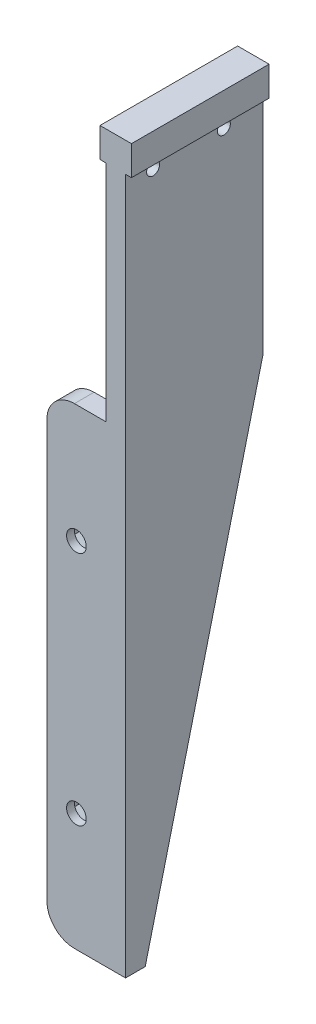
ISO-10303-21;
HEADER;
FILE_DESCRIPTION(('STEP AP214'),'2;1');
FILE_NAME('part.step','',(''),(''),'','','');
FILE_SCHEMA(('AUTOMOTIVE_DESIGN { 1 0 10303 214 1 1 1 1 }'));
ENDSEC;
DATA;
#1=APPLICATION_CONTEXT('core data for automotive mechanical design processes');
#2=APPLICATION_PROTOCOL_DEFINITION('international standard','automotive_design',2000,#1);
#3=PRODUCT_CONTEXT('',#1,'mechanical');
#4=PRODUCT('Part','Part','',(#3));
#5=PRODUCT_RELATED_PRODUCT_CATEGORY('part','',(#4));
#6=PRODUCT_DEFINITION_FORMATION('','',#4);
#7=PRODUCT_DEFINITION_CONTEXT('part definition',#1,'design');
#8=PRODUCT_DEFINITION('design','',#6,#7);
#9=PRODUCT_DEFINITION_SHAPE('','',#8);
#10=(LENGTH_UNIT() NAMED_UNIT(*) SI_UNIT(.MILLI.,.METRE.));
#11=(NAMED_UNIT(*) PLANE_ANGLE_UNIT() SI_UNIT($,.RADIAN.));
#12=(NAMED_UNIT(*) SI_UNIT($,.STERADIAN.) SOLID_ANGLE_UNIT());
#13=UNCERTAINTY_MEASURE_WITH_UNIT(LENGTH_MEASURE(1.E-05),#10,'distance_accuracy_value','');
#14=(GEOMETRIC_REPRESENTATION_CONTEXT(3) GLOBAL_UNCERTAINTY_ASSIGNED_CONTEXT((#13)) GLOBAL_UNIT_ASSIGNED_CONTEXT((#10,
#11,#12)) REPRESENTATION_CONTEXT('',''));
#15=CARTESIAN_POINT('',(0.,0.,0.));
#16=DIRECTION('',(0.,0.,1.));
#17=DIRECTION('',(1.,0.,0.));
#18=AXIS2_PLACEMENT_3D('',#15,#16,#17);
#19=CARTESIAN_POINT('',(43.25,-88.5,0.));
#20=DIRECTION('',(0.,0.,1.));
#21=DIRECTION('',(-1.,0.,0.));
#22=AXIS2_PLACEMENT_3D('',#19,#20,#21);
#23=PLANE('',#22);
#24=DIRECTION('',(-0.866025403784439,-0.5,0.));
#25=VECTOR('',#24,1.);
#26=CARTESIAN_POINT('',(42.,-154.214101615138,0.));
#27=LINE('',#26,#25);
#28=CARTESIAN_POINT('',(44.,-153.059401076758,0.));
#29=VERTEX_POINT('',#28);
#30=CARTESIAN_POINT('',(40.,-155.368802153517,0.));
#31=VERTEX_POINT('',#30);
#32=EDGE_CURVE('E334',#29,#31,#27,.T.);
#33=ORIENTED_EDGE('',*,*,#32,.F.);
#34=DIRECTION('',(0.,-1.,0.));
#35=VECTOR('',#34,1.);
#36=CARTESIAN_POINT('',(44.,-152.576981701919,0.));
#37=LINE('',#36,#35);
#38=CARTESIAN_POINT('',(44.,-148.440598923241,0.));
#39=VERTEX_POINT('',#38);
#40=EDGE_CURVE('E368',#39,#29,#37,.T.);
#41=ORIENTED_EDGE('',*,*,#40,.F.);
#42=DIRECTION('',(0.866025403784439,-0.5,0.));
#43=VECTOR('',#42,1.);
#44=CARTESIAN_POINT('',(43.5822125661116,-148.199389235822,0.));
#45=LINE('',#44,#43);
#46=CARTESIAN_POINT('',(40.,-146.131197846483,0.));
#47=VERTEX_POINT('',#46);
#48=EDGE_CURVE('E364',#47,#39,#45,.T.);
#49=ORIENTED_EDGE('',*,*,#48,.F.);
#50=DIRECTION('',(0.866025403784439,0.5,0.));
#51=VECTOR('',#50,1.);
#52=CARTESIAN_POINT('',(38.,-147.285898384862,0.));
#53=LINE('',#52,#51);
#54=CARTESIAN_POINT('',(36.,-148.440598923241,0.));
#55=VERTEX_POINT('',#54);
#56=EDGE_CURVE('E360',#55,#47,#53,.T.);
#57=ORIENTED_EDGE('',*,*,#56,.F.);
#58=DIRECTION('',(0.,1.,0.));
#59=VECTOR('',#58,1.);
#60=CARTESIAN_POINT('',(36.,-152.576981701919,0.));
#61=LINE('',#60,#59);
#62=CARTESIAN_POINT('',(36.,-153.059401076758,0.));
#63=VERTEX_POINT('',#62);
#64=EDGE_CURVE('E357',#63,#55,#61,.T.);
#65=ORIENTED_EDGE('',*,*,#64,.F.);
#66=DIRECTION('',(-0.866025403784439,0.5,0.));
#67=VECTOR('',#66,1.);
#68=CARTESIAN_POINT('',(39.5822125661117,-155.127592466097,0.));
#69=LINE('',#68,#67);
#70=EDGE_CURVE('E354',#31,#63,#69,.T.);
#71=ORIENTED_EDGE('',*,*,#70,.F.);
#72=EDGE_LOOP('',(#33,#41,#49,#57,#65,#71));
#73=FACE_BOUND('',#72,.T.);
#74=DIRECTION('',(0.,1.,0.));
#75=VECTOR('',#74,1.);
#76=CARTESIAN_POINT('',(32.5,-120.390110716224,0.));
#77=LINE('',#76,#75);
#78=CARTESIAN_POINT('',(32.5,-173.75,0.));
#79=VERTEX_POINT('',#78);
#80=CARTESIAN_POINT('',(32.5,-67.75,0.));
#81=VERTEX_POINT('',#80);
#82=EDGE_CURVE('E465',#79,#81,#77,.T.);
#83=ORIENTED_EDGE('',*,*,#82,.T.);
#84=CARTESIAN_POINT('',(39.5,-67.75,0.));
#85=DIRECTION('',(0.,0.,-1.));
#86=DIRECTION('',(-1.,0.,0.));
#87=AXIS2_PLACEMENT_3D('',#84,#85,#86);
#88=CIRCLE('',#87,7.);
#89=CARTESIAN_POINT('',(39.5,-60.75,0.));
#90=VERTEX_POINT('',#89);
#91=EDGE_CURVE('E509',#90,#81,#88,.F.);
#92=ORIENTED_EDGE('',*,*,#91,.F.);
#93=DIRECTION('',(-1.,0.,0.));
#94=VECTOR('',#93,1.);
#95=CARTESIAN_POINT('',(37.6372709870339,-60.75,0.));
#96=LINE('',#95,#94);
#97=CARTESIAN_POINT('',(47.5,-60.75,0.));
#98=VERTEX_POINT('',#97);
#99=EDGE_CURVE('E430',#98,#90,#96,.T.);
#100=ORIENTED_EDGE('',*,*,#99,.F.);
#101=DIRECTION('',(0.,1.,0.));
#102=VECTOR('',#101,1.);
#103=CARTESIAN_POINT('',(47.5,-120.140110716224,0.));
#104=LINE('',#103,#102);
#105=CARTESIAN_POINT('',(47.5,-180.75,0.));
#106=VERTEX_POINT('',#105);
#107=EDGE_CURVE('E394',#106,#98,#104,.T.);
#108=ORIENTED_EDGE('',*,*,#107,.F.);
#109=DIRECTION('',(-1.,0.,0.));
#110=VECTOR('',#109,1.);
#111=CARTESIAN_POINT('',(49.6868979042284,-180.75,0.));
#112=LINE('',#111,#110);
#113=CARTESIAN_POINT('',(39.5,-180.75,0.));
#114=VERTEX_POINT('',#113);
#115=EDGE_CURVE('E421',#106,#114,#112,.T.);
#116=ORIENTED_EDGE('',*,*,#115,.T.);
#117=CARTESIAN_POINT('',(39.5,-173.75,0.));
#118=DIRECTION('',(0.,0.,-1.));
#119=DIRECTION('',(-1.,0.,0.));
#120=AXIS2_PLACEMENT_3D('',#117,#118,#119);
#121=CIRCLE('',#120,7.);
#122=EDGE_CURVE('E513',#79,#114,#121,.F.);
#123=ORIENTED_EDGE('',*,*,#122,.F.);
#124=EDGE_LOOP('',(#83,#92,#100,#108,#116,#123));
#125=FACE_BOUND('',#124,.T.);
#126=DIRECTION('',(-0.866025403784439,-0.5,0.));
#127=VECTOR('',#126,1.);
#128=CARTESIAN_POINT('',(42.,-94.2141016151378,0.));
#129=LINE('',#128,#127);
#130=CARTESIAN_POINT('',(44.,-93.0594010767585,0.));
#131=VERTEX_POINT('',#130);
#132=CARTESIAN_POINT('',(40.,-95.368802153517,0.));
#133=VERTEX_POINT('',#132);
#134=EDGE_CURVE('E302',#131,#133,#129,.T.);
#135=ORIENTED_EDGE('',*,*,#134,.F.);
#136=DIRECTION('',(0.,-1.,0.));
#137=VECTOR('',#136,1.);
#138=CARTESIAN_POINT('',(44.,-90.75,0.));
#139=LINE('',#138,#137);
#140=CARTESIAN_POINT('',(44.,-88.4405989232415,0.));
#141=VERTEX_POINT('',#140);
#142=EDGE_CURVE('E265',#141,#131,#139,.T.);
#143=ORIENTED_EDGE('',*,*,#142,.F.);
#144=DIRECTION('',(0.866025403784439,-0.5,0.));
#145=VECTOR('',#144,1.);
#146=CARTESIAN_POINT('',(45.9094844589459,-89.5430402896273,0.));
#147=LINE('',#146,#145);
#148=CARTESIAN_POINT('',(40.,-86.131197846483,0.));
#149=VERTEX_POINT('',#148);
#150=EDGE_CURVE('E307',#149,#141,#147,.T.);
#151=ORIENTED_EDGE('',*,*,#150,.F.);
#152=DIRECTION('',(0.866025403784439,0.5,0.));
#153=VECTOR('',#152,1.);
#154=CARTESIAN_POINT('',(34.0905155410541,-89.5430402896273,0.));
#155=LINE('',#154,#153);
#156=CARTESIAN_POINT('',(36.,-88.4405989232415,0.));
#157=VERTEX_POINT('',#156);
#158=EDGE_CURVE('E311',#157,#149,#155,.T.);
#159=ORIENTED_EDGE('',*,*,#158,.F.);
#160=DIRECTION('',(0.,1.,0.));
#161=VECTOR('',#160,1.);
#162=CARTESIAN_POINT('',(36.,-90.75,0.));
#163=LINE('',#162,#161);
#164=CARTESIAN_POINT('',(36.,-93.0594010767585,0.));
#165=VERTEX_POINT('',#164);
#166=EDGE_CURVE('E281',#165,#157,#163,.T.);
#167=ORIENTED_EDGE('',*,*,#166,.F.);
#168=DIRECTION('',(-0.866025403784439,0.5,0.));
#169=VECTOR('',#168,1.);
#170=CARTESIAN_POINT('',(41.9094844589459,-96.4712435199029,0.));
#171=LINE('',#170,#169);
#172=EDGE_CURVE('E276',#133,#165,#171,.T.);
#173=ORIENTED_EDGE('',*,*,#172,.F.);
#174=EDGE_LOOP('',(#135,#143,#151,#159,#167,#173));
#175=FACE_BOUND('',#174,.T.);
#176=ADVANCED_FACE('F16',(#73,#125,#175),#23,.F.);
#177=CARTESIAN_POINT('',(47.5,-142.342267394872,5.));
#178=DIRECTION('',(-1.,0.,0.));
#179=DIRECTION('',(0.,1.,0.));
#180=AXIS2_PLACEMENT_3D('',#177,#178,#179);
#181=PLANE('',#180);
#182=CARTESIAN_POINT('',(47.5,-5.95,-20.));
#183=DIRECTION('',(1.,0.,0.));
#184=DIRECTION('',(0.,1.,0.));
#185=AXIS2_PLACEMENT_3D('',#182,#183,#184);
#186=CIRCLE('',#185,1.65);
#187=CARTESIAN_POINT('',(47.5,-4.3,-20.));
#188=VERTEX_POINT('',#187);
#189=EDGE_CURVE('E20',#188,#188,#186,.T.);
#190=ORIENTED_EDGE('',*,*,#189,.T.);
#191=EDGE_LOOP('',(#190));
#192=FACE_BOUND('',#191,.T.);
#193=CARTESIAN_POINT('',(47.5,-5.95,-2.));
#194=DIRECTION('',(1.,0.,0.));
#195=DIRECTION('',(0.,1.,0.));
#196=AXIS2_PLACEMENT_3D('',#193,#194,#195);
#197=CIRCLE('',#196,1.65);
#198=CARTESIAN_POINT('',(47.5,-4.3,-2.));
#199=VERTEX_POINT('',#198);
#200=EDGE_CURVE('E538',#199,#199,#197,.T.);
#201=ORIENTED_EDGE('',*,*,#200,.T.);
#202=EDGE_LOOP('',(#201));
#203=FACE_BOUND('',#202,.T.);
#204=ORIENTED_EDGE('',*,*,#107,.T.);
#205=DIRECTION('',(0.,0.,-1.));
#206=VECTOR('',#205,1.);
#207=CARTESIAN_POINT('',(47.5,-60.75,5.));
#208=LINE('',#207,#206);
#209=CARTESIAN_POINT('',(47.5,-60.75,5.));
#210=VERTEX_POINT('',#209);
#211=EDGE_CURVE('E461',#210,#98,#208,.T.);
#212=ORIENTED_EDGE('',*,*,#211,.F.);
#213=DIRECTION('',(0.,-1.,0.));
#214=VECTOR('',#213,1.);
#215=CARTESIAN_POINT('',(47.5,-142.342267394872,5.));
#216=LINE('',#215,#214);
#217=CARTESIAN_POINT('',(47.5,-3.75,5.));
#218=VERTEX_POINT('',#217);
#219=EDGE_CURVE('E434',#218,#210,#216,.T.);
#220=ORIENTED_EDGE('',*,*,#219,.F.);
#221=DIRECTION('',(0.,0.,-1.));
#222=VECTOR('',#221,1.);
#223=CARTESIAN_POINT('',(47.5,-3.75,5.));
#224=LINE('',#223,#222);
#225=CARTESIAN_POINT('',(47.5,-3.75,-30.));
#226=VERTEX_POINT('',#225);
#227=EDGE_CURVE('E481',#218,#226,#224,.T.);
#228=ORIENTED_EDGE('',*,*,#227,.T.);
#229=DIRECTION('',(0.,1.,0.));
#230=VECTOR('',#229,1.);
#231=CARTESIAN_POINT('',(47.5,-120.140110716224,-30.));
#232=LINE('',#231,#230);
#233=CARTESIAN_POINT('',(47.5,-60.75,-30.));
#234=VERTEX_POINT('',#233);
#235=EDGE_CURVE('E402',#234,#226,#232,.T.);
#236=ORIENTED_EDGE('',*,*,#235,.F.);
#237=DIRECTION('',(0.,-0.970142500145332,0.242535625036333));
#238=VECTOR('',#237,1.);
#239=CARTESIAN_POINT('',(47.5,-145.778016371644,-8.74299590708886));
#240=LINE('',#239,#238);
#241=EDGE_CURVE('E533',#106,#234,#240,.F.);
#242=ORIENTED_EDGE('',*,*,#241,.F.);
#243=EDGE_LOOP('',(#204,#212,#220,#228,#236,#242));
#244=FACE_BOUND('',#243,.T.);
#245=ADVANCED_FACE('F575',(#192,#203,#244),#181,.T.);
#246=CARTESIAN_POINT('',(49.75,-3.75,5.));
#247=DIRECTION('',(0.,1.,0.));
#248=DIRECTION('',(0.,0.,1.));
#249=AXIS2_PLACEMENT_3D('',#246,#247,#248);
#250=PLANE('',#249);
#251=ORIENTED_EDGE('',*,*,#227,.F.);
#252=DIRECTION('',(-1.,0.,0.));
#253=VECTOR('',#252,1.);
#254=CARTESIAN_POINT('',(49.75,-3.75,5.));
#255=LINE('',#254,#253);
#256=CARTESIAN_POINT('',(46.,-3.75,5.));
#257=VERTEX_POINT('',#256);
#258=EDGE_CURVE('E457',#218,#257,#255,.T.);
#259=ORIENTED_EDGE('',*,*,#258,.T.);
#260=DIRECTION('',(0.,0.,-1.));
#261=VECTOR('',#260,1.);
#262=CARTESIAN_POINT('',(46.,-3.75,5.));
#263=LINE('',#262,#261);
#264=CARTESIAN_POINT('',(46.,-3.75,-30.));
#265=VERTEX_POINT('',#264);
#266=EDGE_CURVE('E476',#257,#265,#263,.T.);
#267=ORIENTED_EDGE('',*,*,#266,.T.);
#268=DIRECTION('',(-1.,0.,0.));
#269=VECTOR('',#268,1.);
#270=CARTESIAN_POINT('',(49.75,-3.75,-30.));
#271=LINE('',#270,#269);
#272=EDGE_CURVE('E417',#226,#265,#271,.T.);
#273=ORIENTED_EDGE('',*,*,#272,.F.);
#274=EDGE_LOOP('',(#251,#259,#267,#273));
#275=FACE_BOUND('',#274,.T.);
#276=ADVANCED_FACE('F581',(#275),#250,.F.);
#277=CARTESIAN_POINT('',(46.,8.72091965636974,5.));
#278=DIRECTION('',(-1.,0.,0.));
#279=DIRECTION('',(0.,1.,0.));
#280=AXIS2_PLACEMENT_3D('',#277,#278,#279);
#281=PLANE('',#280);
#282=ORIENTED_EDGE('',*,*,#266,.F.);
#283=DIRECTION('',(0.,-1.,0.));
#284=VECTOR('',#283,1.);
#285=CARTESIAN_POINT('',(46.,8.72091965636974,5.));
#286=LINE('',#285,#284);
#287=CARTESIAN_POINT('',(46.,3.75,5.));
#288=VERTEX_POINT('',#287);
#289=EDGE_CURVE('E458',#288,#257,#286,.T.);
#290=ORIENTED_EDGE('',*,*,#289,.F.);
#291=DIRECTION('',(0.,0.,-1.));
#292=VECTOR('',#291,1.);
#293=CARTESIAN_POINT('',(46.,3.75,5.));
#294=LINE('',#293,#292);
#295=CARTESIAN_POINT('',(46.,3.75,-30.));
#296=VERTEX_POINT('',#295);
#297=EDGE_CURVE('E472',#288,#296,#294,.T.);
#298=ORIENTED_EDGE('',*,*,#297,.T.);
#299=DIRECTION('',(0.,-1.,0.));
#300=VECTOR('',#299,1.);
#301=CARTESIAN_POINT('',(46.,8.72091965636974,-30.));
#302=LINE('',#301,#300);
#303=EDGE_CURVE('E418',#296,#265,#302,.T.);
#304=ORIENTED_EDGE('',*,*,#303,.T.);
#305=EDGE_LOOP('',(#282,#290,#298,#304));
#306=FACE_BOUND('',#305,.T.);
#307=ADVANCED_FACE('F590',(#306),#281,.T.);
#308=CARTESIAN_POINT('',(34.587839727214,3.75,5.));
#309=DIRECTION('',(0.,1.,0.));
#310=DIRECTION('',(0.,0.,1.));
#311=AXIS2_PLACEMENT_3D('',#308,#309,#310);
#312=PLANE('',#311);
#313=ORIENTED_EDGE('',*,*,#297,.F.);
#314=DIRECTION('',(-1.,0.,0.));
#315=VECTOR('',#314,1.);
#316=CARTESIAN_POINT('',(34.587839727214,3.75,5.));
#317=LINE('',#316,#315);
#318=CARTESIAN_POINT('',(54.,3.75,5.));
#319=VERTEX_POINT('',#318);
#320=EDGE_CURVE('E446',#319,#288,#317,.T.);
#321=ORIENTED_EDGE('',*,*,#320,.F.);
#322=DIRECTION('',(0.,0.,-1.));
#323=VECTOR('',#322,1.);
#324=CARTESIAN_POINT('',(54.,3.75,5.));
#325=LINE('',#324,#323);
#326=CARTESIAN_POINT('',(54.,3.75,-30.));
#327=VERTEX_POINT('',#326);
#328=EDGE_CURVE('E477',#319,#327,#325,.T.);
#329=ORIENTED_EDGE('',*,*,#328,.T.);
#330=DIRECTION('',(-1.,0.,0.));
#331=VECTOR('',#330,1.);
#332=CARTESIAN_POINT('',(34.587839727214,3.75,-30.));
#333=LINE('',#332,#331);
#334=EDGE_CURVE('E406',#327,#296,#333,.T.);
#335=ORIENTED_EDGE('',*,*,#334,.T.);
#336=EDGE_LOOP('',(#313,#321,#329,#335));
#337=FACE_BOUND('',#336,.T.);
#338=ADVANCED_FACE('F593',(#337),#312,.T.);
#339=CARTESIAN_POINT('',(54.,8.72091965636975,5.));
#340=DIRECTION('',(-1.,0.,0.));
#341=DIRECTION('',(0.,1.,0.));
#342=AXIS2_PLACEMENT_3D('',#339,#340,#341);
#343=PLANE('',#342);
#344=ORIENTED_EDGE('',*,*,#328,.F.);
#345=DIRECTION('',(0.,-1.,0.));
#346=VECTOR('',#345,1.);
#347=CARTESIAN_POINT('',(54.,8.72091965636975,5.));
#348=LINE('',#347,#346);
#349=CARTESIAN_POINT('',(54.,-3.75,5.));
#350=VERTEX_POINT('',#349);
#351=EDGE_CURVE('E449',#319,#350,#348,.T.);
#352=ORIENTED_EDGE('',*,*,#351,.T.);
#353=DIRECTION('',(0.,0.,-1.));
#354=VECTOR('',#353,1.);
#355=CARTESIAN_POINT('',(54.,-3.75,5.));
#356=LINE('',#355,#354);
#357=CARTESIAN_POINT('',(54.,-3.75,-30.));
#358=VERTEX_POINT('',#357);
#359=EDGE_CURVE('E482',#350,#358,#356,.T.);
#360=ORIENTED_EDGE('',*,*,#359,.T.);
#361=DIRECTION('',(0.,-1.,0.));
#362=VECTOR('',#361,1.);
#363=CARTESIAN_POINT('',(54.,8.72091965636975,-30.));
#364=LINE('',#363,#362);
#365=EDGE_CURVE('E409',#327,#358,#364,.T.);
#366=ORIENTED_EDGE('',*,*,#365,.F.);
#367=EDGE_LOOP('',(#344,#352,#360,#366));
#368=FACE_BOUND('',#367,.T.);
#369=ADVANCED_FACE('F599',(#368),#343,.F.);
#370=ORIENTED_EDGE('',*,*,#359,.F.);
#371=CARTESIAN_POINT('',(52.5,-3.75,5.));
#372=VERTEX_POINT('',#371);
#373=EDGE_CURVE('E453',#350,#372,#255,.T.);
#374=ORIENTED_EDGE('',*,*,#373,.T.);
#375=DIRECTION('',(0.,0.,-1.));
#376=VECTOR('',#375,1.);
#377=CARTESIAN_POINT('',(52.5,-3.75,5.));
#378=LINE('',#377,#376);
#379=CARTESIAN_POINT('',(52.5,-3.75,-30.));
#380=VERTEX_POINT('',#379);
#381=EDGE_CURVE('E486',#372,#380,#378,.T.);
#382=ORIENTED_EDGE('',*,*,#381,.T.);
#383=EDGE_CURVE('E413',#358,#380,#271,.T.);
#384=ORIENTED_EDGE('',*,*,#383,.F.);
#385=EDGE_LOOP('',(#370,#374,#382,#384));
#386=FACE_BOUND('',#385,.T.);
#387=ADVANCED_FACE('F598',(#386),#250,.F.);
#388=CARTESIAN_POINT('',(52.5,-142.342267394872,5.));
#389=DIRECTION('',(-1.,0.,0.));
#390=DIRECTION('',(0.,1.,0.));
#391=AXIS2_PLACEMENT_3D('',#388,#389,#390);
#392=PLANE('',#391);
#393=CARTESIAN_POINT('',(52.5,-5.95,-20.));
#394=DIRECTION('',(-1.,0.,0.));
#395=DIRECTION('',(0.,-1.,0.));
#396=AXIS2_PLACEMENT_3D('',#393,#394,#395);
#397=CIRCLE('',#396,1.65);
#398=CARTESIAN_POINT('',(52.5,-7.6,-20.));
#399=VERTEX_POINT('',#398);
#400=EDGE_CURVE('E541',#399,#399,#397,.T.);
#401=ORIENTED_EDGE('',*,*,#400,.T.);
#402=EDGE_LOOP('',(#401));
#403=FACE_BOUND('',#402,.T.);
#404=CARTESIAN_POINT('',(52.5,-5.95,-2.));
#405=DIRECTION('',(-1.,0.,0.));
#406=DIRECTION('',(0.,-1.,0.));
#407=AXIS2_PLACEMENT_3D('',#404,#405,#406);
#408=CIRCLE('',#407,1.65);
#409=CARTESIAN_POINT('',(52.5,-7.6,-2.));
#410=VERTEX_POINT('',#409);
#411=EDGE_CURVE('E284',#410,#410,#408,.T.);
#412=ORIENTED_EDGE('',*,*,#411,.T.);
#413=EDGE_LOOP('',(#412));
#414=FACE_BOUND('',#413,.T.);
#415=DIRECTION('',(0.,-1.,0.));
#416=VECTOR('',#415,1.);
#417=CARTESIAN_POINT('',(52.5,-142.342267394872,-30.));
#418=LINE('',#417,#416);
#419=CARTESIAN_POINT('',(52.5,-60.75,-30.));
#420=VERTEX_POINT('',#419);
#421=EDGE_CURVE('E398',#380,#420,#418,.T.);
#422=ORIENTED_EDGE('',*,*,#421,.F.);
#423=ORIENTED_EDGE('',*,*,#381,.F.);
#424=DIRECTION('',(0.,-1.,0.));
#425=VECTOR('',#424,1.);
#426=CARTESIAN_POINT('',(52.5,-142.342267394872,5.));
#427=LINE('',#426,#425);
#428=CARTESIAN_POINT('',(52.5,-180.75,5.));
#429=VERTEX_POINT('',#428);
#430=EDGE_CURVE('E425',#372,#429,#427,.T.);
#431=ORIENTED_EDGE('',*,*,#430,.T.);
#432=DIRECTION('',(0.,0.,-1.));
#433=VECTOR('',#432,1.);
#434=CARTESIAN_POINT('',(52.5,-180.75,5.));
#435=LINE('',#434,#433);
#436=CARTESIAN_POINT('',(52.5,-180.75,0.));
#437=VERTEX_POINT('',#436);
#438=EDGE_CURVE('E496',#429,#437,#435,.T.);
#439=ORIENTED_EDGE('',*,*,#438,.T.);
#440=DIRECTION('',(0.,0.970142500145332,-0.242535625036333));
#441=VECTOR('',#440,1.);
#442=CARTESIAN_POINT('',(52.5,-180.75,0.));
#443=LINE('',#442,#441);
#444=EDGE_CURVE('E10',#420,#437,#443,.F.);
#445=ORIENTED_EDGE('',*,*,#444,.F.);
#446=EDGE_LOOP('',(#422,#423,#431,#439,#445));
#447=FACE_BOUND('',#446,.T.);
#448=ADVANCED_FACE('F557',(#403,#414,#447),#392,.F.);
#449=CARTESIAN_POINT('',(49.6868979042284,-180.75,5.));
#450=DIRECTION('',(0.,1.,0.));
#451=DIRECTION('',(0.,0.,1.));
#452=AXIS2_PLACEMENT_3D('',#449,#450,#451);
#453=PLANE('',#452);
#454=ORIENTED_EDGE('',*,*,#438,.F.);
#455=DIRECTION('',(-1.,0.,0.));
#456=VECTOR('',#455,1.);
#457=CARTESIAN_POINT('',(49.6868979042284,-180.75,5.));
#458=LINE('',#457,#456);
#459=CARTESIAN_POINT('',(39.5,-180.75,5.));
#460=VERTEX_POINT('',#459);
#461=EDGE_CURVE('E429',#429,#460,#458,.T.);
#462=ORIENTED_EDGE('',*,*,#461,.T.);
#463=DIRECTION('',(0.,0.,-1.));
#464=VECTOR('',#463,1.);
#465=CARTESIAN_POINT('',(39.5,-180.75,5.));
#466=LINE('',#465,#464);
#467=EDGE_CURVE('E517',#114,#460,#466,.F.);
#468=ORIENTED_EDGE('',*,*,#467,.F.);
#469=ORIENTED_EDGE('',*,*,#115,.F.);
#470=DIRECTION('',(-1.,0.,0.));
#471=VECTOR('',#470,1.);
#472=CARTESIAN_POINT('',(49.6868979042284,-180.75,0.));
#473=LINE('',#472,#471);
#474=EDGE_CURVE('E530',#437,#106,#473,.T.);
#475=ORIENTED_EDGE('',*,*,#474,.F.);
#476=EDGE_LOOP('',(#454,#462,#468,#469,#475));
#477=FACE_BOUND('',#476,.T.);
#478=ADVANCED_FACE('F612',(#477),#453,.F.);
#479=CARTESIAN_POINT('',(32.5,-120.390110716224,5.));
#480=DIRECTION('',(1.,0.,0.));
#481=DIRECTION('',(0.,-1.,0.));
#482=AXIS2_PLACEMENT_3D('',#479,#480,#481);
#483=PLANE('',#482);
#484=DIRECTION('',(0.,1.,0.));
#485=VECTOR('',#484,1.);
#486=CARTESIAN_POINT('',(32.5,-120.390110716224,5.));
#487=LINE('',#486,#485);
#488=CARTESIAN_POINT('',(32.5,-173.75,5.));
#489=VERTEX_POINT('',#488);
#490=CARTESIAN_POINT('',(32.5,-67.75,5.));
#491=VERTEX_POINT('',#490);
#492=EDGE_CURVE('E438',#489,#491,#487,.T.);
#493=ORIENTED_EDGE('',*,*,#492,.T.);
#494=DIRECTION('',(0.,0.,-1.));
#495=VECTOR('',#494,1.);
#496=CARTESIAN_POINT('',(32.5,-67.75,5.));
#497=LINE('',#496,#495);
#498=EDGE_CURVE('E493',#81,#491,#497,.F.);
#499=ORIENTED_EDGE('',*,*,#498,.F.);
#500=ORIENTED_EDGE('',*,*,#82,.F.);
#501=DIRECTION('',(0.,0.,-1.));
#502=VECTOR('',#501,1.);
#503=CARTESIAN_POINT('',(32.5,-173.75,5.));
#504=LINE('',#503,#502);
#505=EDGE_CURVE('E506',#489,#79,#504,.T.);
#506=ORIENTED_EDGE('',*,*,#505,.F.);
#507=EDGE_LOOP('',(#493,#499,#500,#506));
#508=FACE_BOUND('',#507,.T.);
#509=ADVANCED_FACE('F609',(#508),#483,.F.);
#510=CARTESIAN_POINT('',(37.6372709870339,-60.75,5.));
#511=DIRECTION('',(0.,1.,0.));
#512=DIRECTION('',(0.,0.,1.));
#513=AXIS2_PLACEMENT_3D('',#510,#511,#512);
#514=PLANE('',#513);
#515=DIRECTION('',(-1.,0.,0.));
#516=VECTOR('',#515,1.);
#517=CARTESIAN_POINT('',(37.6372709870339,-60.75,5.));
#518=LINE('',#517,#516);
#519=CARTESIAN_POINT('',(39.5,-60.75,5.));
#520=VERTEX_POINT('',#519);
#521=EDGE_CURVE('E442',#210,#520,#518,.T.);
#522=ORIENTED_EDGE('',*,*,#521,.F.);
#523=ORIENTED_EDGE('',*,*,#211,.T.);
#524=ORIENTED_EDGE('',*,*,#99,.T.);
#525=DIRECTION('',(0.,0.,-1.));
#526=VECTOR('',#525,1.);
#527=CARTESIAN_POINT('',(39.5,-60.75,0.));
#528=LINE('',#527,#526);
#529=EDGE_CURVE('E527',#520,#90,#528,.T.);
#530=ORIENTED_EDGE('',*,*,#529,.F.);
#531=EDGE_LOOP('',(#522,#523,#524,#530));
#532=FACE_BOUND('',#531,.T.);
#533=ADVANCED_FACE('F606',(#532),#514,.T.);
#534=CARTESIAN_POINT('',(43.25,-88.5,5.));
#535=DIRECTION('',(0.,0.,1.));
#536=DIRECTION('',(-1.,0.,0.));
#537=AXIS2_PLACEMENT_3D('',#534,#535,#536);
#538=PLANE('',#537);
#539=CARTESIAN_POINT('',(40.,-90.75,4.99999999999545));
#540=DIRECTION('',(0.,0.,-1.));
#541=DIRECTION('',(-1.,0.,0.));
#542=AXIS2_PLACEMENT_3D('',#539,#540,#541);
#543=CIRCLE('',#542,2.5);
#544=CARTESIAN_POINT('',(37.5,-90.75,4.99999999999545));
#545=VERTEX_POINT('',#544);
#546=EDGE_CURVE('E390',#545,#545,#543,.F.);
#547=ORIENTED_EDGE('',*,*,#546,.F.);
#548=EDGE_LOOP('',(#547));
#549=FACE_BOUND('',#548,.T.);
#550=CARTESIAN_POINT('',(40.,-150.75,4.99999999999545));
#551=DIRECTION('',(0.,0.,-1.));
#552=DIRECTION('',(-1.,0.,0.));
#553=AXIS2_PLACEMENT_3D('',#550,#551,#552);
#554=CIRCLE('',#553,2.5);
#555=CARTESIAN_POINT('',(37.5,-150.75,4.99999999999545));
#556=VERTEX_POINT('',#555);
#557=EDGE_CURVE('E270',#556,#556,#554,.F.);
#558=ORIENTED_EDGE('',*,*,#557,.F.);
#559=EDGE_LOOP('',(#558));
#560=FACE_BOUND('',#559,.T.);
#561=ORIENTED_EDGE('',*,*,#461,.F.);
#562=ORIENTED_EDGE('',*,*,#430,.F.);
#563=ORIENTED_EDGE('',*,*,#373,.F.);
#564=ORIENTED_EDGE('',*,*,#351,.F.);
#565=ORIENTED_EDGE('',*,*,#320,.T.);
#566=ORIENTED_EDGE('',*,*,#289,.T.);
#567=ORIENTED_EDGE('',*,*,#258,.F.);
#568=ORIENTED_EDGE('',*,*,#219,.T.);
#569=ORIENTED_EDGE('',*,*,#521,.T.);
#570=CARTESIAN_POINT('',(39.5,-67.75,5.));
#571=DIRECTION('',(0.,0.,-1.));
#572=DIRECTION('',(-1.,0.,0.));
#573=AXIS2_PLACEMENT_3D('',#570,#571,#572);
#574=CIRCLE('',#573,7.);
#575=EDGE_CURVE('E521',#491,#520,#574,.T.);
#576=ORIENTED_EDGE('',*,*,#575,.F.);
#577=ORIENTED_EDGE('',*,*,#492,.F.);
#578=CARTESIAN_POINT('',(39.5,-173.75,5.));
#579=DIRECTION('',(0.,0.,-1.));
#580=DIRECTION('',(-1.,0.,0.));
#581=AXIS2_PLACEMENT_3D('',#578,#579,#580);
#582=CIRCLE('',#581,7.);
#583=EDGE_CURVE('E524',#460,#489,#582,.T.);
#584=ORIENTED_EDGE('',*,*,#583,.F.);
#585=EDGE_LOOP('',(#561,#562,#563,#564,#565,#566,#567,#568,#569,#576,#577,#584));
#586=FACE_BOUND('',#585,.T.);
#587=ADVANCED_FACE('F588',(#549,#560,#586),#538,.T.);
#588=CARTESIAN_POINT('',(43.25,-88.5,-30.));
#589=DIRECTION('',(0.,0.,1.));
#590=DIRECTION('',(-1.,0.,0.));
#591=AXIS2_PLACEMENT_3D('',#588,#589,#590);
#592=PLANE('',#591);
#593=ORIENTED_EDGE('',*,*,#235,.T.);
#594=ORIENTED_EDGE('',*,*,#272,.T.);
#595=ORIENTED_EDGE('',*,*,#303,.F.);
#596=ORIENTED_EDGE('',*,*,#334,.F.);
#597=ORIENTED_EDGE('',*,*,#365,.T.);
#598=ORIENTED_EDGE('',*,*,#383,.T.);
#599=ORIENTED_EDGE('',*,*,#421,.T.);
#600=DIRECTION('',(1.,0.,0.));
#601=VECTOR('',#600,1.);
#602=CARTESIAN_POINT('',(43.25,-60.75,-30.));
#603=LINE('',#602,#601);
#604=EDGE_CURVE('E26',#234,#420,#603,.T.);
#605=ORIENTED_EDGE('',*,*,#604,.F.);
#606=EDGE_LOOP('',(#593,#594,#595,#596,#597,#598,#599,#605));
#607=FACE_BOUND('',#606,.T.);
#608=ADVANCED_FACE('F623',(#607),#592,.F.);
#609=CARTESIAN_POINT('',(39.5,-173.75,5.));
#610=DIRECTION('',(0.,0.,-1.));
#611=DIRECTION('',(1.,0.,0.));
#612=AXIS2_PLACEMENT_3D('',#609,#610,#611);
#613=CYLINDRICAL_SURFACE('',#612,7.);
#614=ORIENTED_EDGE('',*,*,#583,.T.);
#615=ORIENTED_EDGE('',*,*,#505,.T.);
#616=ORIENTED_EDGE('',*,*,#122,.T.);
#617=ORIENTED_EDGE('',*,*,#467,.T.);
#618=EDGE_LOOP('',(#614,#615,#616,#617));
#619=FACE_BOUND('',#618,.T.);
#620=ADVANCED_FACE('F620',(#619),#613,.T.);
#621=CARTESIAN_POINT('',(39.5,-67.75,5.));
#622=DIRECTION('',(0.,0.,1.));
#623=DIRECTION('',(-1.,0.,0.));
#624=AXIS2_PLACEMENT_3D('',#621,#622,#623);
#625=CYLINDRICAL_SURFACE('',#624,7.);
#626=ORIENTED_EDGE('',*,*,#575,.T.);
#627=ORIENTED_EDGE('',*,*,#529,.T.);
#628=ORIENTED_EDGE('',*,*,#91,.T.);
#629=ORIENTED_EDGE('',*,*,#498,.T.);
#630=EDGE_LOOP('',(#626,#627,#628,#629));
#631=FACE_BOUND('',#630,.T.);
#632=ADVANCED_FACE('F622',(#631),#625,.T.);
#633=CARTESIAN_POINT('',(49.6868979042284,-180.75,0.));
#634=DIRECTION('',(0.,0.242535625036333,0.970142500145332));
#635=DIRECTION('',(-1.,0.,0.));
#636=AXIS2_PLACEMENT_3D('',#633,#634,#635);
#637=PLANE('',#636);
#638=ORIENTED_EDGE('',*,*,#444,.T.);
#639=ORIENTED_EDGE('',*,*,#474,.T.);
#640=ORIENTED_EDGE('',*,*,#241,.T.);
#641=ORIENTED_EDGE('',*,*,#604,.T.);
#642=EDGE_LOOP('',(#638,#639,#640,#641));
#643=FACE_BOUND('',#642,.T.);
#644=ADVANCED_FACE('F18',(#643),#637,.F.);
#645=CARTESIAN_POINT('',(40.,-150.75,500000.));
#646=DIRECTION('',(0.,0.,-1.));
#647=DIRECTION('',(1.,0.,0.));
#648=AXIS2_PLACEMENT_3D('',#645,#646,#647);
#649=CYLINDRICAL_SURFACE('',#648,2.5);
#650=CARTESIAN_POINT('',(40.,-150.75,3.));
#651=DIRECTION('',(0.,0.,1.));
#652=DIRECTION('',(-1.,0.,0.));
#653=AXIS2_PLACEMENT_3D('',#650,#651,#652);
#654=CIRCLE('',#653,2.5);
#655=CARTESIAN_POINT('',(37.5,-150.75,3.));
#656=VERTEX_POINT('',#655);
#657=EDGE_CURVE('E329',#656,#656,#654,.T.);
#658=ORIENTED_EDGE('',*,*,#657,.F.);
#659=EDGE_LOOP('',(#658));
#660=FACE_BOUND('',#659,.T.);
#661=ORIENTED_EDGE('',*,*,#557,.T.);
#662=EDGE_LOOP('',(#661));
#663=FACE_BOUND('',#662,.T.);
#664=ADVANCED_FACE('F630',(#660,#663),#649,.F.);
#665=CARTESIAN_POINT('',(40.,-90.75,500000.));
#666=DIRECTION('',(0.,0.,-1.));
#667=DIRECTION('',(1.,0.,0.));
#668=AXIS2_PLACEMENT_3D('',#665,#666,#667);
#669=CYLINDRICAL_SURFACE('',#668,2.5);
#670=CARTESIAN_POINT('',(40.,-90.75,3.));
#671=DIRECTION('',(0.,0.,1.));
#672=DIRECTION('',(-1.,0.,0.));
#673=AXIS2_PLACEMENT_3D('',#670,#671,#672);
#674=CIRCLE('',#673,2.5);
#675=CARTESIAN_POINT('',(37.5,-90.75,3.));
#676=VERTEX_POINT('',#675);
#677=EDGE_CURVE('E298',#676,#676,#674,.T.);
#678=ORIENTED_EDGE('',*,*,#677,.F.);
#679=EDGE_LOOP('',(#678));
#680=FACE_BOUND('',#679,.T.);
#681=ORIENTED_EDGE('',*,*,#546,.T.);
#682=EDGE_LOOP('',(#681));
#683=FACE_BOUND('',#682,.T.);
#684=ADVANCED_FACE('F742',(#680,#683),#669,.F.);
#685=CARTESIAN_POINT('',(42.,-154.214101615138,3.));
#686=DIRECTION('',(-0.5,0.866025403784439,0.));
#687=DIRECTION('',(0.866025403784439,0.5,0.));
#688=AXIS2_PLACEMENT_3D('',#685,#686,#687);
#689=PLANE('',#688);
#690=ORIENTED_EDGE('',*,*,#32,.T.);
#691=DIRECTION('',(0.,0.,-1.));
#692=VECTOR('',#691,1.);
#693=CARTESIAN_POINT('',(40.,-155.368802153517,3.));
#694=LINE('',#693,#692);
#695=CARTESIAN_POINT('',(40.,-155.368802153517,3.));
#696=VERTEX_POINT('',#695);
#697=EDGE_CURVE('E353',#696,#31,#694,.T.);
#698=ORIENTED_EDGE('',*,*,#697,.F.);
#699=DIRECTION('',(-0.866025403784439,-0.5,0.));
#700=VECTOR('',#699,1.);
#701=CARTESIAN_POINT('',(42.,-154.214101615138,3.));
#702=LINE('',#701,#700);
#703=CARTESIAN_POINT('',(44.,-153.059401076758,3.));
#704=VERTEX_POINT('',#703);
#705=EDGE_CURVE('E349',#704,#696,#702,.T.);
#706=ORIENTED_EDGE('',*,*,#705,.F.);
#707=DIRECTION('',(0.,0.,-1.));
#708=VECTOR('',#707,1.);
#709=CARTESIAN_POINT('',(44.,-153.059401076758,3.));
#710=LINE('',#709,#708);
#711=EDGE_CURVE('E304',#704,#29,#710,.T.);
#712=ORIENTED_EDGE('',*,*,#711,.T.);
#713=EDGE_LOOP('',(#690,#698,#706,#712));
#714=FACE_BOUND('',#713,.T.);
#715=ADVANCED_FACE('F746',(#714),#689,.T.);
#716=CARTESIAN_POINT('',(44.,-152.576981701919,3.));
#717=DIRECTION('',(-1.,0.,0.));
#718=DIRECTION('',(0.,1.,0.));
#719=AXIS2_PLACEMENT_3D('',#716,#717,#718);
#720=PLANE('',#719);
#721=ORIENTED_EDGE('',*,*,#40,.T.);
#722=ORIENTED_EDGE('',*,*,#711,.F.);
#723=DIRECTION('',(0.,-1.,0.));
#724=VECTOR('',#723,1.);
#725=CARTESIAN_POINT('',(44.,-152.576981701919,3.));
#726=LINE('',#725,#724);
#727=CARTESIAN_POINT('',(44.,-148.440598923241,3.));
#728=VERTEX_POINT('',#727);
#729=EDGE_CURVE('E346',#728,#704,#726,.T.);
#730=ORIENTED_EDGE('',*,*,#729,.F.);
#731=DIRECTION('',(0.,0.,-1.));
#732=VECTOR('',#731,1.);
#733=CARTESIAN_POINT('',(44.,-148.440598923241,3.));
#734=LINE('',#733,#732);
#735=EDGE_CURVE('E377',#728,#39,#734,.T.);
#736=ORIENTED_EDGE('',*,*,#735,.T.);
#737=EDGE_LOOP('',(#721,#722,#730,#736));
#738=FACE_BOUND('',#737,.T.);
#739=ADVANCED_FACE('F763',(#738),#720,.T.);
#740=CARTESIAN_POINT('',(43.5822125661116,-148.199389235822,3.));
#741=DIRECTION('',(-0.5,-0.866025403784439,0.));
#742=DIRECTION('',(-0.866025403784439,0.5,0.));
#743=AXIS2_PLACEMENT_3D('',#740,#741,#742);
#744=PLANE('',#743);
#745=ORIENTED_EDGE('',*,*,#48,.T.);
#746=ORIENTED_EDGE('',*,*,#735,.F.);
#747=DIRECTION('',(0.866025403784439,-0.5,0.));
#748=VECTOR('',#747,1.);
#749=CARTESIAN_POINT('',(43.5822125661116,-148.199389235822,3.));
#750=LINE('',#749,#748);
#751=CARTESIAN_POINT('',(40.,-146.131197846483,3.));
#752=VERTEX_POINT('',#751);
#753=EDGE_CURVE('E343',#752,#728,#750,.T.);
#754=ORIENTED_EDGE('',*,*,#753,.F.);
#755=DIRECTION('',(0.,0.,-1.));
#756=VECTOR('',#755,1.);
#757=CARTESIAN_POINT('',(40.,-146.131197846483,3.));
#758=LINE('',#757,#756);
#759=EDGE_CURVE('E380',#752,#47,#758,.T.);
#760=ORIENTED_EDGE('',*,*,#759,.T.);
#761=EDGE_LOOP('',(#745,#746,#754,#760));
#762=FACE_BOUND('',#761,.T.);
#763=ADVANCED_FACE('F759',(#762),#744,.T.);
#764=CARTESIAN_POINT('',(38.,-147.285898384862,3.));
#765=DIRECTION('',(0.5,-0.866025403784439,0.));
#766=DIRECTION('',(-0.866025403784439,-0.5,0.));
#767=AXIS2_PLACEMENT_3D('',#764,#765,#766);
#768=PLANE('',#767);
#769=ORIENTED_EDGE('',*,*,#56,.T.);
#770=ORIENTED_EDGE('',*,*,#759,.F.);
#771=DIRECTION('',(0.866025403784439,0.5,0.));
#772=VECTOR('',#771,1.);
#773=CARTESIAN_POINT('',(38.,-147.285898384862,3.));
#774=LINE('',#773,#772);
#775=CARTESIAN_POINT('',(36.,-148.440598923241,3.));
#776=VERTEX_POINT('',#775);
#777=EDGE_CURVE('E340',#776,#752,#774,.T.);
#778=ORIENTED_EDGE('',*,*,#777,.F.);
#779=DIRECTION('',(0.,0.,-1.));
#780=VECTOR('',#779,1.);
#781=CARTESIAN_POINT('',(36.,-148.440598923241,3.));
#782=LINE('',#781,#780);
#783=EDGE_CURVE('E383',#776,#55,#782,.T.);
#784=ORIENTED_EDGE('',*,*,#783,.T.);
#785=EDGE_LOOP('',(#769,#770,#778,#784));
#786=FACE_BOUND('',#785,.T.);
#787=ADVANCED_FACE('F756',(#786),#768,.T.);
#788=CARTESIAN_POINT('',(36.,-152.576981701919,3.));
#789=DIRECTION('',(1.,0.,0.));
#790=DIRECTION('',(0.,-1.,0.));
#791=AXIS2_PLACEMENT_3D('',#788,#789,#790);
#792=PLANE('',#791);
#793=ORIENTED_EDGE('',*,*,#64,.T.);
#794=ORIENTED_EDGE('',*,*,#783,.F.);
#795=DIRECTION('',(0.,1.,0.));
#796=VECTOR('',#795,1.);
#797=CARTESIAN_POINT('',(36.,-152.576981701919,3.));
#798=LINE('',#797,#796);
#799=CARTESIAN_POINT('',(36.,-153.059401076758,3.));
#800=VERTEX_POINT('',#799);
#801=EDGE_CURVE('E337',#800,#776,#798,.T.);
#802=ORIENTED_EDGE('',*,*,#801,.F.);
#803=DIRECTION('',(0.,0.,-1.));
#804=VECTOR('',#803,1.);
#805=CARTESIAN_POINT('',(36.,-153.059401076758,3.));
#806=LINE('',#805,#804);
#807=EDGE_CURVE('E51',#800,#63,#806,.T.);
#808=ORIENTED_EDGE('',*,*,#807,.T.);
#809=EDGE_LOOP('',(#793,#794,#802,#808));
#810=FACE_BOUND('',#809,.T.);
#811=ADVANCED_FACE('F752',(#810),#792,.T.);
#812=CARTESIAN_POINT('',(39.5822125661117,-155.127592466097,3.));
#813=DIRECTION('',(0.5,0.866025403784439,0.));
#814=DIRECTION('',(0.866025403784439,-0.5,0.));
#815=AXIS2_PLACEMENT_3D('',#812,#813,#814);
#816=PLANE('',#815);
#817=ORIENTED_EDGE('',*,*,#70,.T.);
#818=ORIENTED_EDGE('',*,*,#807,.F.);
#819=DIRECTION('',(-0.866025403784439,0.5,0.));
#820=VECTOR('',#819,1.);
#821=CARTESIAN_POINT('',(39.5822125661117,-155.127592466097,3.));
#822=LINE('',#821,#820);
#823=EDGE_CURVE('E333',#696,#800,#822,.T.);
#824=ORIENTED_EDGE('',*,*,#823,.F.);
#825=ORIENTED_EDGE('',*,*,#697,.T.);
#826=EDGE_LOOP('',(#817,#818,#824,#825));
#827=FACE_BOUND('',#826,.T.);
#828=ADVANCED_FACE('F748',(#827),#816,.T.);
#829=CARTESIAN_POINT('',(40.,-120.75,3.));
#830=DIRECTION('',(0.,0.,-1.));
#831=DIRECTION('',(-1.,0.,0.));
#832=AXIS2_PLACEMENT_3D('',#829,#830,#831);
#833=PLANE('',#832);
#834=ORIENTED_EDGE('',*,*,#705,.T.);
#835=ORIENTED_EDGE('',*,*,#823,.T.);
#836=ORIENTED_EDGE('',*,*,#801,.T.);
#837=ORIENTED_EDGE('',*,*,#777,.T.);
#838=ORIENTED_EDGE('',*,*,#753,.T.);
#839=ORIENTED_EDGE('',*,*,#729,.T.);
#840=EDGE_LOOP('',(#834,#835,#836,#837,#838,#839));
#841=FACE_BOUND('',#840,.T.);
#842=ORIENTED_EDGE('',*,*,#657,.T.);
#843=EDGE_LOOP('',(#842));
#844=FACE_BOUND('',#843,.T.);
#845=ADVANCED_FACE('F751',(#841,#844),#833,.T.);
#846=CARTESIAN_POINT('',(42.,-94.2141016151378,3.));
#847=DIRECTION('',(-0.5,0.866025403784439,0.));
#848=DIRECTION('',(0.866025403784439,0.5,0.));
#849=AXIS2_PLACEMENT_3D('',#846,#847,#848);
#850=PLANE('',#849);
#851=ORIENTED_EDGE('',*,*,#134,.T.);
#852=DIRECTION('',(0.,0.,-1.));
#853=VECTOR('',#852,1.);
#854=CARTESIAN_POINT('',(40.,-95.368802153517,3.));
#855=LINE('',#854,#853);
#856=CARTESIAN_POINT('',(40.,-95.368802153517,3.));
#857=VERTEX_POINT('',#856);
#858=EDGE_CURVE('E274',#857,#133,#855,.T.);
#859=ORIENTED_EDGE('',*,*,#858,.F.);
#860=DIRECTION('',(-0.866025403784439,-0.5,0.));
#861=VECTOR('',#860,1.);
#862=CARTESIAN_POINT('',(42.,-94.2141016151378,3.));
#863=LINE('',#862,#861);
#864=CARTESIAN_POINT('',(44.,-93.0594010767585,3.));
#865=VERTEX_POINT('',#864);
#866=EDGE_CURVE('E253',#865,#857,#863,.T.);
#867=ORIENTED_EDGE('',*,*,#866,.F.);
#868=DIRECTION('',(0.,0.,-1.));
#869=VECTOR('',#868,1.);
#870=CARTESIAN_POINT('',(44.,-93.0594010767585,3.));
#871=LINE('',#870,#869);
#872=EDGE_CURVE('E262',#865,#131,#871,.T.);
#873=ORIENTED_EDGE('',*,*,#872,.T.);
#874=EDGE_LOOP('',(#851,#859,#867,#873));
#875=FACE_BOUND('',#874,.T.);
#876=ADVANCED_FACE('F273',(#875),#850,.T.);
#877=CARTESIAN_POINT('',(44.,-90.75,3.));
#878=DIRECTION('',(-1.,0.,0.));
#879=DIRECTION('',(0.,1.,0.));
#880=AXIS2_PLACEMENT_3D('',#877,#878,#879);
#881=PLANE('',#880);
#882=ORIENTED_EDGE('',*,*,#142,.T.);
#883=ORIENTED_EDGE('',*,*,#872,.F.);
#884=DIRECTION('',(0.,-1.,0.));
#885=VECTOR('',#884,1.);
#886=CARTESIAN_POINT('',(44.,-90.75,3.));
#887=LINE('',#886,#885);
#888=CARTESIAN_POINT('',(44.,-88.4405989232415,3.));
#889=VERTEX_POINT('',#888);
#890=EDGE_CURVE('E248',#889,#865,#887,.T.);
#891=ORIENTED_EDGE('',*,*,#890,.F.);
#892=DIRECTION('',(0.,0.,-1.));
#893=VECTOR('',#892,1.);
#894=CARTESIAN_POINT('',(44.,-88.4405989232415,3.));
#895=LINE('',#894,#893);
#896=EDGE_CURVE('E271',#889,#141,#895,.T.);
#897=ORIENTED_EDGE('',*,*,#896,.T.);
#898=EDGE_LOOP('',(#882,#883,#891,#897));
#899=FACE_BOUND('',#898,.T.);
#900=ADVANCED_FACE('F263',(#899),#881,.T.);
#901=CARTESIAN_POINT('',(45.9094844589459,-89.5430402896273,3.));
#902=DIRECTION('',(-0.5,-0.866025403784439,0.));
#903=DIRECTION('',(-0.866025403784439,0.5,0.));
#904=AXIS2_PLACEMENT_3D('',#901,#902,#903);
#905=PLANE('',#904);
#906=ORIENTED_EDGE('',*,*,#150,.T.);
#907=ORIENTED_EDGE('',*,*,#896,.F.);
#908=DIRECTION('',(0.866025403784439,-0.5,0.));
#909=VECTOR('',#908,1.);
#910=CARTESIAN_POINT('',(45.9094844589459,-89.5430402896273,3.));
#911=LINE('',#910,#909);
#912=CARTESIAN_POINT('',(40.,-86.131197846483,3.));
#913=VERTEX_POINT('',#912);
#914=EDGE_CURVE('E256',#913,#889,#911,.T.);
#915=ORIENTED_EDGE('',*,*,#914,.F.);
#916=DIRECTION('',(0.,0.,-1.));
#917=VECTOR('',#916,1.);
#918=CARTESIAN_POINT('',(40.,-86.131197846483,3.));
#919=LINE('',#918,#917);
#920=EDGE_CURVE('E324',#913,#149,#919,.T.);
#921=ORIENTED_EDGE('',*,*,#920,.T.);
#922=EDGE_LOOP('',(#906,#907,#915,#921));
#923=FACE_BOUND('',#922,.T.);
#924=ADVANCED_FACE('F778',(#923),#905,.T.);
#925=CARTESIAN_POINT('',(34.0905155410541,-89.5430402896273,3.));
#926=DIRECTION('',(0.5,-0.866025403784439,0.));
#927=DIRECTION('',(-0.866025403784439,-0.5,0.));
#928=AXIS2_PLACEMENT_3D('',#925,#926,#927);
#929=PLANE('',#928);
#930=ORIENTED_EDGE('',*,*,#158,.T.);
#931=ORIENTED_EDGE('',*,*,#920,.F.);
#932=DIRECTION('',(0.866025403784439,0.5,0.));
#933=VECTOR('',#932,1.);
#934=CARTESIAN_POINT('',(34.0905155410541,-89.5430402896273,3.));
#935=LINE('',#934,#933);
#936=CARTESIAN_POINT('',(36.,-88.4405989232415,3.));
#937=VERTEX_POINT('',#936);
#938=EDGE_CURVE('E289',#937,#913,#935,.T.);
#939=ORIENTED_EDGE('',*,*,#938,.F.);
#940=DIRECTION('',(0.,0.,-1.));
#941=VECTOR('',#940,1.);
#942=CARTESIAN_POINT('',(36.,-88.4405989232415,3.));
#943=LINE('',#942,#941);
#944=EDGE_CURVE('E321',#937,#157,#943,.T.);
#945=ORIENTED_EDGE('',*,*,#944,.T.);
#946=EDGE_LOOP('',(#930,#931,#939,#945));
#947=FACE_BOUND('',#946,.T.);
#948=ADVANCED_FACE('F781',(#947),#929,.T.);
#949=CARTESIAN_POINT('',(36.,-90.75,3.));
#950=DIRECTION('',(1.,0.,0.));
#951=DIRECTION('',(0.,-1.,0.));
#952=AXIS2_PLACEMENT_3D('',#949,#950,#951);
#953=PLANE('',#952);
#954=ORIENTED_EDGE('',*,*,#166,.T.);
#955=ORIENTED_EDGE('',*,*,#944,.F.);
#956=DIRECTION('',(0.,1.,0.));
#957=VECTOR('',#956,1.);
#958=CARTESIAN_POINT('',(36.,-90.75,3.));
#959=LINE('',#958,#957);
#960=CARTESIAN_POINT('',(36.,-93.0594010767585,3.));
#961=VERTEX_POINT('',#960);
#962=EDGE_CURVE('E292',#961,#937,#959,.T.);
#963=ORIENTED_EDGE('',*,*,#962,.F.);
#964=DIRECTION('',(0.,0.,-1.));
#965=VECTOR('',#964,1.);
#966=CARTESIAN_POINT('',(36.,-93.0594010767585,3.));
#967=LINE('',#966,#965);
#968=EDGE_CURVE('E39',#961,#165,#967,.T.);
#969=ORIENTED_EDGE('',*,*,#968,.T.);
#970=EDGE_LOOP('',(#954,#955,#963,#969));
#971=FACE_BOUND('',#970,.T.);
#972=ADVANCED_FACE('F785',(#971),#953,.T.);
#973=CARTESIAN_POINT('',(41.9094844589459,-96.4712435199029,3.));
#974=DIRECTION('',(0.5,0.866025403784439,0.));
#975=DIRECTION('',(0.866025403784439,-0.5,0.));
#976=AXIS2_PLACEMENT_3D('',#973,#974,#975);
#977=PLANE('',#976);
#978=ORIENTED_EDGE('',*,*,#172,.T.);
#979=ORIENTED_EDGE('',*,*,#968,.F.);
#980=DIRECTION('',(-0.866025403784439,0.5,0.));
#981=VECTOR('',#980,1.);
#982=CARTESIAN_POINT('',(41.9094844589459,-96.4712435199029,3.));
#983=LINE('',#982,#981);
#984=EDGE_CURVE('E295',#857,#961,#983,.T.);
#985=ORIENTED_EDGE('',*,*,#984,.F.);
#986=ORIENTED_EDGE('',*,*,#858,.T.);
#987=EDGE_LOOP('',(#978,#979,#985,#986));
#988=FACE_BOUND('',#987,.T.);
#989=ADVANCED_FACE('F572',(#988),#977,.T.);
#990=CARTESIAN_POINT('',(40.,-120.75,3.));
#991=DIRECTION('',(0.,0.,-1.));
#992=DIRECTION('',(-1.,0.,0.));
#993=AXIS2_PLACEMENT_3D('',#990,#991,#992);
#994=PLANE('',#993);
#995=ORIENTED_EDGE('',*,*,#866,.T.);
#996=ORIENTED_EDGE('',*,*,#984,.T.);
#997=ORIENTED_EDGE('',*,*,#962,.T.);
#998=ORIENTED_EDGE('',*,*,#938,.T.);
#999=ORIENTED_EDGE('',*,*,#914,.T.);
#1000=ORIENTED_EDGE('',*,*,#890,.T.);
#1001=EDGE_LOOP('',(#995,#996,#997,#998,#999,#1000));
#1002=FACE_BOUND('',#1001,.T.);
#1003=ORIENTED_EDGE('',*,*,#677,.T.);
#1004=EDGE_LOOP('',(#1003));
#1005=FACE_BOUND('',#1004,.T.);
#1006=ADVANCED_FACE('F250',(#1002,#1005),#994,.T.);
#1007=CARTESIAN_POINT('',(27.5,-5.95,-2.));
#1008=DIRECTION('',(1.,0.,0.));
#1009=DIRECTION('',(0.,-1.,0.));
#1010=AXIS2_PLACEMENT_3D('',#1007,#1008,#1009);
#1011=CYLINDRICAL_SURFACE('',#1010,1.65);
#1012=ORIENTED_EDGE('',*,*,#200,.F.);
#1013=EDGE_LOOP('',(#1012));
#1014=FACE_BOUND('',#1013,.T.);
#1015=ORIENTED_EDGE('',*,*,#411,.F.);
#1016=EDGE_LOOP('',(#1015));
#1017=FACE_BOUND('',#1016,.T.);
#1018=ADVANCED_FACE('F560',(#1014,#1017),#1011,.F.);
#1019=CARTESIAN_POINT('',(27.5,-5.95,-20.));
#1020=DIRECTION('',(1.,0.,0.));
#1021=DIRECTION('',(0.,-1.,0.));
#1022=AXIS2_PLACEMENT_3D('',#1019,#1020,#1021);
#1023=CYLINDRICAL_SURFACE('',#1022,1.65);
#1024=ORIENTED_EDGE('',*,*,#189,.F.);
#1025=EDGE_LOOP('',(#1024));
#1026=FACE_BOUND('',#1025,.T.);
#1027=ORIENTED_EDGE('',*,*,#400,.F.);
#1028=EDGE_LOOP('',(#1027));
#1029=FACE_BOUND('',#1028,.T.);
#1030=ADVANCED_FACE('F562',(#1026,#1029),#1023,.F.);
#1031=CLOSED_SHELL('',(#176,#245,#276,#307,#338,#369,#387,#448,#478,#509,#533,#587,#608,#620,
#632,#644,#664,#684,#715,#739,#763,#787,#811,#828,#845,#876,#900,#924,#948,#972,#989,#1006,
#1018,#1030));
#1032=MANIFOLD_SOLID_BREP('B1',#1031);
#1033=ADVANCED_BREP_SHAPE_REPRESENTATION('',(#18,#1032),#14);
#1034=SHAPE_DEFINITION_REPRESENTATION(#9,#1033);
ENDSEC;
END-ISO-10303-21;
